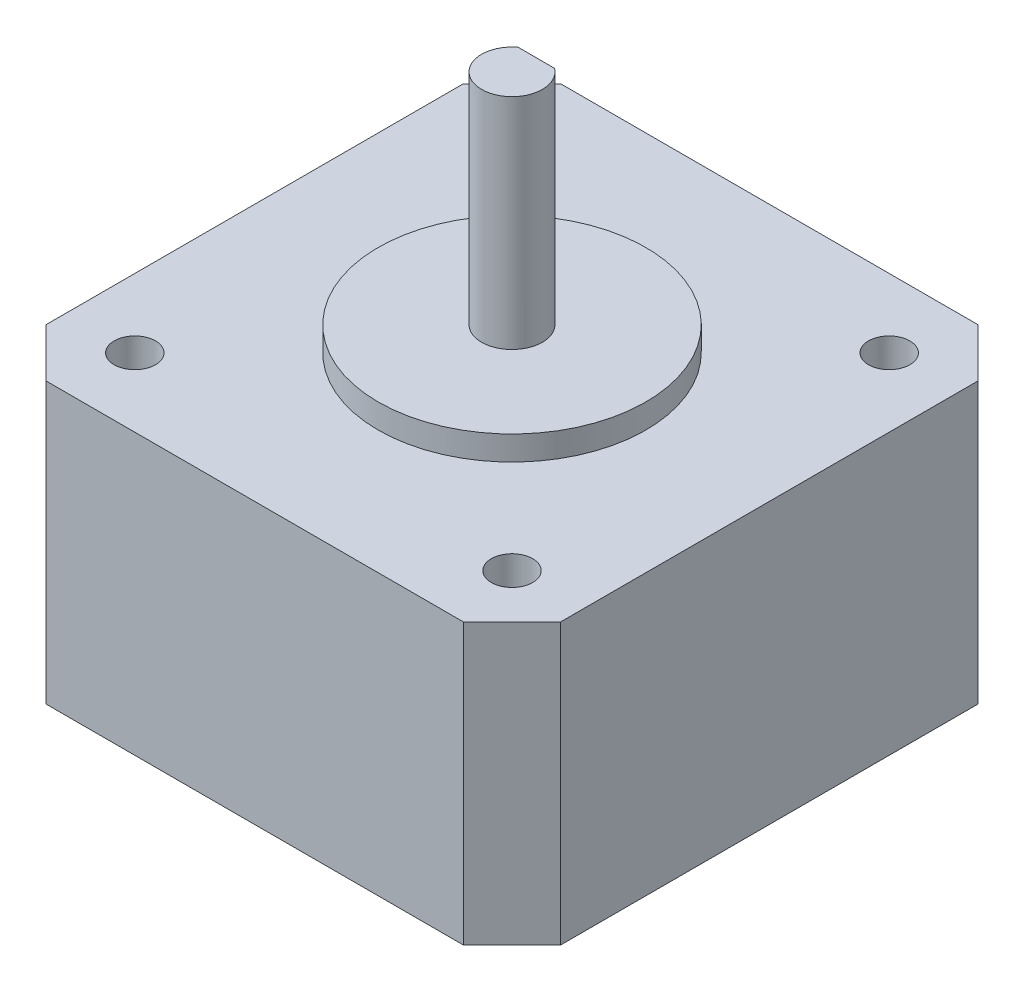
ISO-10303-21;
HEADER;
FILE_DESCRIPTION(('STEP AP214'),'2;1');
FILE_NAME('part.step','',(''),(''),'','','');
FILE_SCHEMA(('AUTOMOTIVE_DESIGN { 1 0 10303 214 1 1 1 1 }'));
ENDSEC;
DATA;
#1=APPLICATION_CONTEXT('core data for automotive mechanical design processes');
#2=APPLICATION_PROTOCOL_DEFINITION('international standard','automotive_design',2000,#1);
#3=PRODUCT_CONTEXT('',#1,'mechanical');
#4=PRODUCT('Part','Part','',(#3));
#5=PRODUCT_RELATED_PRODUCT_CATEGORY('part','',(#4));
#6=PRODUCT_DEFINITION_FORMATION('','',#4);
#7=PRODUCT_DEFINITION_CONTEXT('part definition',#1,'design');
#8=PRODUCT_DEFINITION('design','',#6,#7);
#9=PRODUCT_DEFINITION_SHAPE('','',#8);
#10=(LENGTH_UNIT() NAMED_UNIT(*) SI_UNIT(.MILLI.,.METRE.));
#11=(NAMED_UNIT(*) PLANE_ANGLE_UNIT() SI_UNIT($,.RADIAN.));
#12=(NAMED_UNIT(*) SI_UNIT($,.STERADIAN.) SOLID_ANGLE_UNIT());
#13=UNCERTAINTY_MEASURE_WITH_UNIT(LENGTH_MEASURE(1.E-05),#10,'distance_accuracy_value','');
#14=(GEOMETRIC_REPRESENTATION_CONTEXT(3) GLOBAL_UNCERTAINTY_ASSIGNED_CONTEXT((#13)) GLOBAL_UNIT_ASSIGNED_CONTEXT((#10,
#11,#12)) REPRESENTATION_CONTEXT('',''));
#15=CARTESIAN_POINT('',(0.,0.,0.));
#16=DIRECTION('',(0.,0.,1.));
#17=DIRECTION('',(1.,0.,0.));
#18=AXIS2_PLACEMENT_3D('',#15,#16,#17);
#19=CARTESIAN_POINT('',(17.15,23.,21.15));
#20=DIRECTION('',(-0.707106781186547,0.,-0.707106781186547));
#21=DIRECTION('',(-0.707106781186548,0.,0.707106781186548));
#22=AXIS2_PLACEMENT_3D('',#19,#20,#21);
#23=PLANE('',#22);
#24=DIRECTION('',(0.707106781186548,0.,-0.707106781186548));
#25=VECTOR('',#24,1.);
#26=CARTESIAN_POINT('',(17.15,0.,21.15));
#27=LINE('',#26,#25);
#28=CARTESIAN_POINT('',(17.15,0.,21.15));
#29=VERTEX_POINT('',#28);
#30=CARTESIAN_POINT('',(21.15,0.,17.15));
#31=VERTEX_POINT('',#30);
#32=EDGE_CURVE('E148',#29,#31,#27,.T.);
#33=ORIENTED_EDGE('',*,*,#32,.T.);
#34=DIRECTION('',(0.,-1.,0.));
#35=VECTOR('',#34,1.);
#36=CARTESIAN_POINT('',(21.15,23.,17.15));
#37=LINE('',#36,#35);
#38=CARTESIAN_POINT('',(21.15,23.,17.15));
#39=VERTEX_POINT('',#38);
#40=EDGE_CURVE('E45',#39,#31,#37,.T.);
#41=ORIENTED_EDGE('',*,*,#40,.F.);
#42=DIRECTION('',(0.707106781186548,0.,-0.707106781186548));
#43=VECTOR('',#42,1.);
#44=CARTESIAN_POINT('',(17.15,23.,21.15));
#45=LINE('',#44,#43);
#46=CARTESIAN_POINT('',(17.15,23.,21.15));
#47=VERTEX_POINT('',#46);
#48=EDGE_CURVE('E164',#47,#39,#45,.T.);
#49=ORIENTED_EDGE('',*,*,#48,.F.);
#50=DIRECTION('',(0.,-1.,0.));
#51=VECTOR('',#50,1.);
#52=CARTESIAN_POINT('',(17.15,23.,21.15));
#53=LINE('',#52,#51);
#54=EDGE_CURVE('E144',#47,#29,#53,.T.);
#55=ORIENTED_EDGE('',*,*,#54,.T.);
#56=EDGE_LOOP('',(#33,#41,#49,#55));
#57=FACE_BOUND('',#56,.T.);
#58=ADVANCED_FACE('F37',(#57),#23,.F.);
#59=CARTESIAN_POINT('',(21.15,23.,17.15));
#60=DIRECTION('',(-1.,0.,0.));
#61=DIRECTION('',(0.,0.,1.));
#62=AXIS2_PLACEMENT_3D('',#59,#60,#61);
#63=PLANE('',#62);
#64=DIRECTION('',(0.,0.,-1.));
#65=VECTOR('',#64,1.);
#66=CARTESIAN_POINT('',(21.15,0.,17.15));
#67=LINE('',#66,#65);
#68=CARTESIAN_POINT('',(21.15,0.,-17.15));
#69=VERTEX_POINT('',#68);
#70=EDGE_CURVE('E151',#31,#69,#67,.T.);
#71=ORIENTED_EDGE('',*,*,#70,.T.);
#72=DIRECTION('',(0.,-1.,0.));
#73=VECTOR('',#72,1.);
#74=CARTESIAN_POINT('',(21.15,23.,-17.15));
#75=LINE('',#74,#73);
#76=CARTESIAN_POINT('',(21.15,23.,-17.15));
#77=VERTEX_POINT('',#76);
#78=EDGE_CURVE('E174',#77,#69,#75,.T.);
#79=ORIENTED_EDGE('',*,*,#78,.F.);
#80=DIRECTION('',(0.,0.,-1.));
#81=VECTOR('',#80,1.);
#82=CARTESIAN_POINT('',(21.15,23.,17.15));
#83=LINE('',#82,#81);
#84=EDGE_CURVE('E104',#39,#77,#83,.T.);
#85=ORIENTED_EDGE('',*,*,#84,.F.);
#86=ORIENTED_EDGE('',*,*,#40,.T.);
#87=EDGE_LOOP('',(#71,#79,#85,#86));
#88=FACE_BOUND('',#87,.T.);
#89=ADVANCED_FACE('F230',(#88),#63,.F.);
#90=CARTESIAN_POINT('',(21.15,23.,-17.15));
#91=DIRECTION('',(-0.707106781186547,0.,0.707106781186548));
#92=DIRECTION('',(0.707106781186548,0.,0.707106781186547));
#93=AXIS2_PLACEMENT_3D('',#90,#91,#92);
#94=PLANE('',#93);
#95=DIRECTION('',(-0.707106781186548,0.,-0.707106781186547));
#96=VECTOR('',#95,1.);
#97=CARTESIAN_POINT('',(21.15,0.,-17.15));
#98=LINE('',#97,#96);
#99=CARTESIAN_POINT('',(17.15,0.,-21.15));
#100=VERTEX_POINT('',#99);
#101=EDGE_CURVE('E154',#69,#100,#98,.T.);
#102=ORIENTED_EDGE('',*,*,#101,.T.);
#103=DIRECTION('',(0.,-1.,0.));
#104=VECTOR('',#103,1.);
#105=CARTESIAN_POINT('',(17.15,23.,-21.15));
#106=LINE('',#105,#104);
#107=CARTESIAN_POINT('',(17.15,23.,-21.15));
#108=VERTEX_POINT('',#107);
#109=EDGE_CURVE('E171',#108,#100,#106,.T.);
#110=ORIENTED_EDGE('',*,*,#109,.F.);
#111=DIRECTION('',(-0.707106781186548,0.,-0.707106781186547));
#112=VECTOR('',#111,1.);
#113=CARTESIAN_POINT('',(21.15,23.,-17.15));
#114=LINE('',#113,#112);
#115=EDGE_CURVE('E210',#77,#108,#114,.T.);
#116=ORIENTED_EDGE('',*,*,#115,.F.);
#117=ORIENTED_EDGE('',*,*,#78,.T.);
#118=EDGE_LOOP('',(#102,#110,#116,#117));
#119=FACE_BOUND('',#118,.T.);
#120=ADVANCED_FACE('F233',(#119),#94,.F.);
#121=CARTESIAN_POINT('',(17.15,23.,-21.15));
#122=DIRECTION('',(0.,0.,1.));
#123=DIRECTION('',(1.,0.,0.));
#124=AXIS2_PLACEMENT_3D('',#121,#122,#123);
#125=PLANE('',#124);
#126=DIRECTION('',(-1.,0.,0.));
#127=VECTOR('',#126,1.);
#128=CARTESIAN_POINT('',(17.15,0.,-21.15));
#129=LINE('',#128,#127);
#130=CARTESIAN_POINT('',(-17.15,0.,-21.15));
#131=VERTEX_POINT('',#130);
#132=EDGE_CURVE('E156',#100,#131,#129,.T.);
#133=ORIENTED_EDGE('',*,*,#132,.T.);
#134=DIRECTION('',(0.,-1.,0.));
#135=VECTOR('',#134,1.);
#136=CARTESIAN_POINT('',(-17.15,23.,-21.15));
#137=LINE('',#136,#135);
#138=CARTESIAN_POINT('',(-17.15,23.,-21.15));
#139=VERTEX_POINT('',#138);
#140=EDGE_CURVE('E168',#139,#131,#137,.T.);
#141=ORIENTED_EDGE('',*,*,#140,.F.);
#142=DIRECTION('',(-1.,0.,0.));
#143=VECTOR('',#142,1.);
#144=CARTESIAN_POINT('',(17.15,23.,-21.15));
#145=LINE('',#144,#143);
#146=EDGE_CURVE('E212',#108,#139,#145,.T.);
#147=ORIENTED_EDGE('',*,*,#146,.F.);
#148=ORIENTED_EDGE('',*,*,#109,.T.);
#149=EDGE_LOOP('',(#133,#141,#147,#148));
#150=FACE_BOUND('',#149,.T.);
#151=ADVANCED_FACE('F218',(#150),#125,.F.);
#152=CARTESIAN_POINT('',(-17.15,23.,-21.15));
#153=DIRECTION('',(0.707106781186547,0.,0.707106781186548));
#154=DIRECTION('',(0.707106781186548,0.,-0.707106781186547));
#155=AXIS2_PLACEMENT_3D('',#152,#153,#154);
#156=PLANE('',#155);
#157=DIRECTION('',(-0.707106781186548,0.,0.707106781186547));
#158=VECTOR('',#157,1.);
#159=CARTESIAN_POINT('',(-17.15,0.,-21.15));
#160=LINE('',#159,#158);
#161=CARTESIAN_POINT('',(-21.15,0.,-17.15));
#162=VERTEX_POINT('',#161);
#163=EDGE_CURVE('E158',#131,#162,#160,.T.);
#164=ORIENTED_EDGE('',*,*,#163,.T.);
#165=DIRECTION('',(0.,-1.,0.));
#166=VECTOR('',#165,1.);
#167=CARTESIAN_POINT('',(-21.15,23.,-17.15));
#168=LINE('',#167,#166);
#169=CARTESIAN_POINT('',(-21.15,23.,-17.15));
#170=VERTEX_POINT('',#169);
#171=EDGE_CURVE('E139',#170,#162,#168,.T.);
#172=ORIENTED_EDGE('',*,*,#171,.F.);
#173=DIRECTION('',(-0.707106781186548,0.,0.707106781186547));
#174=VECTOR('',#173,1.);
#175=CARTESIAN_POINT('',(-17.15,23.,-21.15));
#176=LINE('',#175,#174);
#177=EDGE_CURVE('E127',#139,#170,#176,.T.);
#178=ORIENTED_EDGE('',*,*,#177,.F.);
#179=ORIENTED_EDGE('',*,*,#140,.T.);
#180=EDGE_LOOP('',(#164,#172,#178,#179));
#181=FACE_BOUND('',#180,.T.);
#182=ADVANCED_FACE('F222',(#181),#156,.F.);
#183=CARTESIAN_POINT('',(-21.15,23.,-17.15));
#184=DIRECTION('',(1.,0.,0.));
#185=DIRECTION('',(0.,0.,-1.));
#186=AXIS2_PLACEMENT_3D('',#183,#184,#185);
#187=PLANE('',#186);
#188=DIRECTION('',(0.,0.,1.));
#189=VECTOR('',#188,1.);
#190=CARTESIAN_POINT('',(-21.15,0.,-17.15));
#191=LINE('',#190,#189);
#192=CARTESIAN_POINT('',(-21.15,0.,17.15));
#193=VERTEX_POINT('',#192);
#194=EDGE_CURVE('E136',#162,#193,#191,.T.);
#195=ORIENTED_EDGE('',*,*,#194,.T.);
#196=DIRECTION('',(0.,-1.,0.));
#197=VECTOR('',#196,1.);
#198=CARTESIAN_POINT('',(-21.15,23.,17.15));
#199=LINE('',#198,#197);
#200=CARTESIAN_POINT('',(-21.15,23.,17.15));
#201=VERTEX_POINT('',#200);
#202=EDGE_CURVE('E133',#201,#193,#199,.T.);
#203=ORIENTED_EDGE('',*,*,#202,.F.);
#204=DIRECTION('',(0.,0.,1.));
#205=VECTOR('',#204,1.);
#206=CARTESIAN_POINT('',(-21.15,23.,-17.15));
#207=LINE('',#206,#205);
#208=EDGE_CURVE('E120',#170,#201,#207,.T.);
#209=ORIENTED_EDGE('',*,*,#208,.F.);
#210=ORIENTED_EDGE('',*,*,#171,.T.);
#211=EDGE_LOOP('',(#195,#203,#209,#210));
#212=FACE_BOUND('',#211,.T.);
#213=ADVANCED_FACE('F134',(#212),#187,.F.);
#214=CARTESIAN_POINT('',(-21.15,23.,17.15));
#215=DIRECTION('',(0.707106781186548,0.,-0.707106781186547));
#216=DIRECTION('',(-0.707106781186547,0.,-0.707106781186548));
#217=AXIS2_PLACEMENT_3D('',#214,#215,#216);
#218=PLANE('',#217);
#219=DIRECTION('',(0.707106781186547,0.,0.707106781186548));
#220=VECTOR('',#219,1.);
#221=CARTESIAN_POINT('',(-21.15,0.,17.15));
#222=LINE('',#221,#220);
#223=CARTESIAN_POINT('',(-17.15,0.,21.15));
#224=VERTEX_POINT('',#223);
#225=EDGE_CURVE('E161',#193,#224,#222,.T.);
#226=ORIENTED_EDGE('',*,*,#225,.T.);
#227=DIRECTION('',(0.,-1.,0.));
#228=VECTOR('',#227,1.);
#229=CARTESIAN_POINT('',(-17.15,23.,21.15));
#230=LINE('',#229,#228);
#231=CARTESIAN_POINT('',(-17.15,23.,21.15));
#232=VERTEX_POINT('',#231);
#233=EDGE_CURVE('E140',#232,#224,#230,.T.);
#234=ORIENTED_EDGE('',*,*,#233,.F.);
#235=DIRECTION('',(0.707106781186547,0.,0.707106781186548));
#236=VECTOR('',#235,1.);
#237=CARTESIAN_POINT('',(-21.15,23.,17.15));
#238=LINE('',#237,#236);
#239=EDGE_CURVE('E124',#201,#232,#238,.T.);
#240=ORIENTED_EDGE('',*,*,#239,.F.);
#241=ORIENTED_EDGE('',*,*,#202,.T.);
#242=EDGE_LOOP('',(#226,#234,#240,#241));
#243=FACE_BOUND('',#242,.T.);
#244=ADVANCED_FACE('F142',(#243),#218,.F.);
#245=CARTESIAN_POINT('',(-17.15,23.,21.15));
#246=DIRECTION('',(0.,0.,-1.));
#247=DIRECTION('',(-1.,0.,0.));
#248=AXIS2_PLACEMENT_3D('',#245,#246,#247);
#249=PLANE('',#248);
#250=DIRECTION('',(1.,0.,0.));
#251=VECTOR('',#250,1.);
#252=CARTESIAN_POINT('',(-17.15,0.,21.15));
#253=LINE('',#252,#251);
#254=EDGE_CURVE('E95',#224,#29,#253,.T.);
#255=ORIENTED_EDGE('',*,*,#254,.T.);
#256=ORIENTED_EDGE('',*,*,#54,.F.);
#257=DIRECTION('',(1.,0.,0.));
#258=VECTOR('',#257,1.);
#259=CARTESIAN_POINT('',(-17.15,23.,21.15));
#260=LINE('',#259,#258);
#261=EDGE_CURVE('E62',#232,#47,#260,.T.);
#262=ORIENTED_EDGE('',*,*,#261,.F.);
#263=ORIENTED_EDGE('',*,*,#233,.T.);
#264=EDGE_LOOP('',(#255,#256,#262,#263));
#265=FACE_BOUND('',#264,.T.);
#266=ADVANCED_FACE('F226',(#265),#249,.F.);
#267=CARTESIAN_POINT('',(0.,23.,0.));
#268=DIRECTION('',(0.,1.,0.));
#269=DIRECTION('',(0.,0.,1.));
#270=AXIS2_PLACEMENT_3D('',#267,#268,#269);
#271=PLANE('',#270);
#272=CARTESIAN_POINT('',(0.,23.,0.));
#273=DIRECTION('',(0.,1.,0.));
#274=DIRECTION('',(0.,0.,1.));
#275=AXIS2_PLACEMENT_3D('',#272,#273,#274);
#276=CIRCLE('',#275,11.);
#277=CARTESIAN_POINT('',(0.,23.,11.));
#278=VERTEX_POINT('',#277);
#279=EDGE_CURVE('E521',#278,#278,#276,.T.);
#280=ORIENTED_EDGE('',*,*,#279,.F.);
#281=EDGE_LOOP('',(#280));
#282=FACE_BOUND('',#281,.T.);
#283=CARTESIAN_POINT('',(15.5,23.,-15.5));
#284=DIRECTION('',(0.,1.,0.));
#285=DIRECTION('',(0.,0.,1.));
#286=AXIS2_PLACEMENT_3D('',#283,#284,#285);
#287=CIRCLE('',#286,1.7);
#288=CARTESIAN_POINT('',(15.5,23.,-13.8));
#289=VERTEX_POINT('',#288);
#290=EDGE_CURVE('E40',#289,#289,#287,.T.);
#291=ORIENTED_EDGE('',*,*,#290,.F.);
#292=EDGE_LOOP('',(#291));
#293=FACE_BOUND('',#292,.T.);
#294=CARTESIAN_POINT('',(-15.5,23.,-15.5));
#295=DIRECTION('',(0.,1.,0.));
#296=DIRECTION('',(0.,0.,1.));
#297=AXIS2_PLACEMENT_3D('',#294,#295,#296);
#298=CIRCLE('',#297,1.7);
#299=CARTESIAN_POINT('',(-15.5,23.,-13.8));
#300=VERTEX_POINT('',#299);
#301=EDGE_CURVE('E185',#300,#300,#298,.T.);
#302=ORIENTED_EDGE('',*,*,#301,.F.);
#303=EDGE_LOOP('',(#302));
#304=FACE_BOUND('',#303,.T.);
#305=CARTESIAN_POINT('',(-15.5,23.,15.5));
#306=DIRECTION('',(0.,1.,0.));
#307=DIRECTION('',(0.,0.,1.));
#308=AXIS2_PLACEMENT_3D('',#305,#306,#307);
#309=CIRCLE('',#308,1.7);
#310=CARTESIAN_POINT('',(-15.5,23.,17.2));
#311=VERTEX_POINT('',#310);
#312=EDGE_CURVE('E181',#311,#311,#309,.T.);
#313=ORIENTED_EDGE('',*,*,#312,.F.);
#314=EDGE_LOOP('',(#313));
#315=FACE_BOUND('',#314,.T.);
#316=CARTESIAN_POINT('',(15.5,23.,15.5));
#317=DIRECTION('',(0.,1.,0.));
#318=DIRECTION('',(0.,0.,1.));
#319=AXIS2_PLACEMENT_3D('',#316,#317,#318);
#320=CIRCLE('',#319,1.7);
#321=CARTESIAN_POINT('',(15.5,23.,17.2));
#322=VERTEX_POINT('',#321);
#323=EDGE_CURVE('E152',#322,#322,#320,.T.);
#324=ORIENTED_EDGE('',*,*,#323,.F.);
#325=EDGE_LOOP('',(#324));
#326=FACE_BOUND('',#325,.T.);
#327=ORIENTED_EDGE('',*,*,#48,.T.);
#328=ORIENTED_EDGE('',*,*,#84,.T.);
#329=ORIENTED_EDGE('',*,*,#115,.T.);
#330=ORIENTED_EDGE('',*,*,#146,.T.);
#331=ORIENTED_EDGE('',*,*,#177,.T.);
#332=ORIENTED_EDGE('',*,*,#208,.T.);
#333=ORIENTED_EDGE('',*,*,#239,.T.);
#334=ORIENTED_EDGE('',*,*,#261,.T.);
#335=EDGE_LOOP('',(#327,#328,#329,#330,#331,#332,#333,#334));
#336=FACE_BOUND('',#335,.T.);
#337=ADVANCED_FACE('F122',(#282,#293,#304,#315,#326,#336),#271,.T.);
#338=CARTESIAN_POINT('',(0.,0.,0.));
#339=DIRECTION('',(0.,1.,0.));
#340=DIRECTION('',(0.,0.,1.));
#341=AXIS2_PLACEMENT_3D('',#338,#339,#340);
#342=PLANE('',#341);
#343=CARTESIAN_POINT('',(15.5,0.,-15.5));
#344=DIRECTION('',(0.,-1.,0.));
#345=DIRECTION('',(0.,0.,-1.));
#346=AXIS2_PLACEMENT_3D('',#343,#344,#345);
#347=CIRCLE('',#346,1.725);
#348=CARTESIAN_POINT('',(15.5,0.,-17.225));
#349=VERTEX_POINT('',#348);
#350=EDGE_CURVE('E526',#349,#349,#347,.T.);
#351=ORIENTED_EDGE('',*,*,#350,.F.);
#352=EDGE_LOOP('',(#351));
#353=FACE_BOUND('',#352,.T.);
#354=CARTESIAN_POINT('',(-15.5,0.,-15.5));
#355=DIRECTION('',(0.,-1.,0.));
#356=DIRECTION('',(0.,0.,-1.));
#357=AXIS2_PLACEMENT_3D('',#354,#355,#356);
#358=CIRCLE('',#357,1.725);
#359=CARTESIAN_POINT('',(-15.5,0.,-17.225));
#360=VERTEX_POINT('',#359);
#361=EDGE_CURVE('E194',#360,#360,#358,.T.);
#362=ORIENTED_EDGE('',*,*,#361,.F.);
#363=EDGE_LOOP('',(#362));
#364=FACE_BOUND('',#363,.T.);
#365=CARTESIAN_POINT('',(-15.5,0.,15.5));
#366=DIRECTION('',(0.,-1.,0.));
#367=DIRECTION('',(0.,0.,-1.));
#368=AXIS2_PLACEMENT_3D('',#365,#366,#367);
#369=CIRCLE('',#368,1.725);
#370=CARTESIAN_POINT('',(-15.5,0.,13.775));
#371=VERTEX_POINT('',#370);
#372=EDGE_CURVE('E187',#371,#371,#369,.T.);
#373=ORIENTED_EDGE('',*,*,#372,.F.);
#374=EDGE_LOOP('',(#373));
#375=FACE_BOUND('',#374,.T.);
#376=CARTESIAN_POINT('',(15.5,0.,15.5));
#377=DIRECTION('',(0.,-1.,0.));
#378=DIRECTION('',(0.,0.,-1.));
#379=AXIS2_PLACEMENT_3D('',#376,#377,#378);
#380=CIRCLE('',#379,1.725);
#381=CARTESIAN_POINT('',(15.5,0.,13.775));
#382=VERTEX_POINT('',#381);
#383=EDGE_CURVE('E183',#382,#382,#380,.T.);
#384=ORIENTED_EDGE('',*,*,#383,.F.);
#385=EDGE_LOOP('',(#384));
#386=FACE_BOUND('',#385,.T.);
#387=ORIENTED_EDGE('',*,*,#32,.F.);
#388=ORIENTED_EDGE('',*,*,#254,.F.);
#389=ORIENTED_EDGE('',*,*,#225,.F.);
#390=ORIENTED_EDGE('',*,*,#194,.F.);
#391=ORIENTED_EDGE('',*,*,#163,.F.);
#392=ORIENTED_EDGE('',*,*,#132,.F.);
#393=ORIENTED_EDGE('',*,*,#101,.F.);
#394=ORIENTED_EDGE('',*,*,#70,.F.);
#395=EDGE_LOOP('',(#387,#388,#389,#390,#391,#392,#393,#394));
#396=FACE_BOUND('',#395,.T.);
#397=ADVANCED_FACE('F225',(#353,#364,#375,#386,#396),#342,.F.);
#398=CARTESIAN_POINT('',(15.5,0.,15.5));
#399=DIRECTION('',(0.,-1.,0.));
#400=DIRECTION('',(0.,0.,-1.));
#401=AXIS2_PLACEMENT_3D('',#398,#399,#400);
#402=CYLINDRICAL_SURFACE('',#401,1.7);
#403=ORIENTED_EDGE('',*,*,#323,.T.);
#404=EDGE_LOOP('',(#403));
#405=FACE_BOUND('',#404,.T.);
#406=CARTESIAN_POINT('',(15.5,0.0250000000000007,15.5));
#407=DIRECTION('',(0.,-1.,0.));
#408=DIRECTION('',(0.,0.,-1.));
#409=AXIS2_PLACEMENT_3D('',#406,#407,#408);
#410=CIRCLE('',#409,1.7);
#411=CARTESIAN_POINT('',(15.5,0.0250000000000007,13.8));
#412=VERTEX_POINT('',#411);
#413=EDGE_CURVE('E180',#412,#412,#410,.T.);
#414=ORIENTED_EDGE('',*,*,#413,.T.);
#415=EDGE_LOOP('',(#414));
#416=FACE_BOUND('',#415,.T.);
#417=ADVANCED_FACE('F308',(#405,#416),#402,.F.);
#418=CARTESIAN_POINT('',(15.5,0.,15.5));
#419=DIRECTION('',(0.,-1.,0.));
#420=DIRECTION('',(0.,0.,-1.));
#421=AXIS2_PLACEMENT_3D('',#418,#419,#420);
#422=CONICAL_SURFACE('',#421,1.725,0.785398163397431);
#423=ORIENTED_EDGE('',*,*,#413,.F.);
#424=EDGE_LOOP('',(#423));
#425=FACE_BOUND('',#424,.T.);
#426=ORIENTED_EDGE('',*,*,#383,.T.);
#427=EDGE_LOOP('',(#426));
#428=FACE_BOUND('',#427,.T.);
#429=ADVANCED_FACE('F319',(#425,#428),#422,.F.);
#430=CARTESIAN_POINT('',(-15.5,0.,15.5));
#431=DIRECTION('',(0.,-1.,0.));
#432=DIRECTION('',(0.,0.,-1.));
#433=AXIS2_PLACEMENT_3D('',#430,#431,#432);
#434=CYLINDRICAL_SURFACE('',#433,1.7);
#435=ORIENTED_EDGE('',*,*,#312,.T.);
#436=EDGE_LOOP('',(#435));
#437=FACE_BOUND('',#436,.T.);
#438=CARTESIAN_POINT('',(-15.5,0.0250000000000007,15.5));
#439=DIRECTION('',(0.,-1.,0.));
#440=DIRECTION('',(0.,0.,-1.));
#441=AXIS2_PLACEMENT_3D('',#438,#439,#440);
#442=CIRCLE('',#441,1.7);
#443=CARTESIAN_POINT('',(-15.5,0.0250000000000007,13.8));
#444=VERTEX_POINT('',#443);
#445=EDGE_CURVE('E184',#444,#444,#442,.T.);
#446=ORIENTED_EDGE('',*,*,#445,.T.);
#447=EDGE_LOOP('',(#446));
#448=FACE_BOUND('',#447,.T.);
#449=ADVANCED_FACE('F330',(#437,#448),#434,.F.);
#450=CARTESIAN_POINT('',(-15.5,0.,15.5));
#451=DIRECTION('',(0.,-1.,0.));
#452=DIRECTION('',(0.,0.,-1.));
#453=AXIS2_PLACEMENT_3D('',#450,#451,#452);
#454=CONICAL_SURFACE('',#453,1.725,0.785398163397431);
#455=ORIENTED_EDGE('',*,*,#445,.F.);
#456=EDGE_LOOP('',(#455));
#457=FACE_BOUND('',#456,.T.);
#458=ORIENTED_EDGE('',*,*,#372,.T.);
#459=EDGE_LOOP('',(#458));
#460=FACE_BOUND('',#459,.T.);
#461=ADVANCED_FACE('F341',(#457,#460),#454,.F.);
#462=CARTESIAN_POINT('',(-15.5,0.,-15.5));
#463=DIRECTION('',(0.,-1.,0.));
#464=DIRECTION('',(0.,0.,-1.));
#465=AXIS2_PLACEMENT_3D('',#462,#463,#464);
#466=CYLINDRICAL_SURFACE('',#465,1.7);
#467=ORIENTED_EDGE('',*,*,#301,.T.);
#468=EDGE_LOOP('',(#467));
#469=FACE_BOUND('',#468,.T.);
#470=CARTESIAN_POINT('',(-15.5,0.0250000000000007,-15.5));
#471=DIRECTION('',(0.,-1.,0.));
#472=DIRECTION('',(0.,0.,-1.));
#473=AXIS2_PLACEMENT_3D('',#470,#471,#472);
#474=CIRCLE('',#473,1.7);
#475=CARTESIAN_POINT('',(-15.5,0.0250000000000007,-17.2));
#476=VERTEX_POINT('',#475);
#477=EDGE_CURVE('E188',#476,#476,#474,.T.);
#478=ORIENTED_EDGE('',*,*,#477,.T.);
#479=EDGE_LOOP('',(#478));
#480=FACE_BOUND('',#479,.T.);
#481=ADVANCED_FACE('F352',(#469,#480),#466,.F.);
#482=CARTESIAN_POINT('',(-15.5,0.,-15.5));
#483=DIRECTION('',(0.,-1.,0.));
#484=DIRECTION('',(0.,0.,-1.));
#485=AXIS2_PLACEMENT_3D('',#482,#483,#484);
#486=CONICAL_SURFACE('',#485,1.725,0.785398163397431);
#487=ORIENTED_EDGE('',*,*,#477,.F.);
#488=EDGE_LOOP('',(#487));
#489=FACE_BOUND('',#488,.T.);
#490=ORIENTED_EDGE('',*,*,#361,.T.);
#491=EDGE_LOOP('',(#490));
#492=FACE_BOUND('',#491,.T.);
#493=ADVANCED_FACE('F363',(#489,#492),#486,.F.);
#494=CARTESIAN_POINT('',(15.5,0.,-15.5));
#495=DIRECTION('',(0.,-1.,0.));
#496=DIRECTION('',(0.,0.,-1.));
#497=AXIS2_PLACEMENT_3D('',#494,#495,#496);
#498=CYLINDRICAL_SURFACE('',#497,1.7);
#499=ORIENTED_EDGE('',*,*,#290,.T.);
#500=EDGE_LOOP('',(#499));
#501=FACE_BOUND('',#500,.T.);
#502=CARTESIAN_POINT('',(15.5,0.0250000000000007,-15.5));
#503=DIRECTION('',(0.,-1.,0.));
#504=DIRECTION('',(0.,0.,-1.));
#505=AXIS2_PLACEMENT_3D('',#502,#503,#504);
#506=CIRCLE('',#505,1.7);
#507=CARTESIAN_POINT('',(15.5,0.0250000000000007,-17.2));
#508=VERTEX_POINT('',#507);
#509=EDGE_CURVE('E530',#508,#508,#506,.T.);
#510=ORIENTED_EDGE('',*,*,#509,.T.);
#511=EDGE_LOOP('',(#510));
#512=FACE_BOUND('',#511,.T.);
#513=ADVANCED_FACE('F373',(#501,#512),#498,.F.);
#514=CARTESIAN_POINT('',(15.5,0.,-15.5));
#515=DIRECTION('',(0.,-1.,0.));
#516=DIRECTION('',(0.,0.,-1.));
#517=AXIS2_PLACEMENT_3D('',#514,#515,#516);
#518=CONICAL_SURFACE('',#517,1.725,0.785398163397431);
#519=ORIENTED_EDGE('',*,*,#509,.F.);
#520=EDGE_LOOP('',(#519));
#521=FACE_BOUND('',#520,.T.);
#522=ORIENTED_EDGE('',*,*,#350,.T.);
#523=EDGE_LOOP('',(#522));
#524=FACE_BOUND('',#523,.T.);
#525=ADVANCED_FACE('F384',(#521,#524),#518,.F.);
#526=CARTESIAN_POINT('',(0.,25.,0.));
#527=DIRECTION('',(0.,-1.,0.));
#528=DIRECTION('',(0.,0.,-1.));
#529=AXIS2_PLACEMENT_3D('',#526,#527,#528);
#530=CYLINDRICAL_SURFACE('',#529,11.);
#531=CARTESIAN_POINT('',(0.,25.,0.));
#532=DIRECTION('',(0.,1.,0.));
#533=DIRECTION('',(0.,0.,1.));
#534=AXIS2_PLACEMENT_3D('',#531,#532,#533);
#535=CIRCLE('',#534,11.);
#536=CARTESIAN_POINT('',(0.,25.,11.));
#537=VERTEX_POINT('',#536);
#538=EDGE_CURVE('E523',#537,#537,#535,.T.);
#539=ORIENTED_EDGE('',*,*,#538,.F.);
#540=EDGE_LOOP('',(#539));
#541=FACE_BOUND('',#540,.T.);
#542=ORIENTED_EDGE('',*,*,#279,.T.);
#543=EDGE_LOOP('',(#542));
#544=FACE_BOUND('',#543,.T.);
#545=ADVANCED_FACE('F395',(#541,#544),#530,.T.);
#546=CARTESIAN_POINT('',(0.,25.,0.));
#547=DIRECTION('',(0.,1.,0.));
#548=DIRECTION('',(0.,0.,1.));
#549=AXIS2_PLACEMENT_3D('',#546,#547,#548);
#550=PLANE('',#549);
#551=CARTESIAN_POINT('',(0.,25.,0.));
#552=DIRECTION('',(0.,1.,0.));
#553=DIRECTION('',(0.,0.,1.));
#554=AXIS2_PLACEMENT_3D('',#551,#552,#553);
#555=CIRCLE('',#554,2.5);
#556=CARTESIAN_POINT('',(0.,25.,2.5));
#557=VERTEX_POINT('',#556);
#558=EDGE_CURVE('E11',#557,#557,#555,.T.);
#559=ORIENTED_EDGE('',*,*,#558,.F.);
#560=EDGE_LOOP('',(#559));
#561=FACE_BOUND('',#560,.T.);
#562=ORIENTED_EDGE('',*,*,#538,.T.);
#563=EDGE_LOOP('',(#562));
#564=FACE_BOUND('',#563,.T.);
#565=ADVANCED_FACE('F414',(#561,#564),#550,.T.);
#566=CARTESIAN_POINT('',(0.,43.,0.));
#567=DIRECTION('',(0.,-1.,0.));
#568=DIRECTION('',(0.,0.,-1.));
#569=AXIS2_PLACEMENT_3D('',#566,#567,#568);
#570=CYLINDRICAL_SURFACE('',#569,2.5);
#571=CARTESIAN_POINT('',(0.,43.,0.));
#572=DIRECTION('',(0.,1.,0.));
#573=DIRECTION('',(0.,0.,1.));
#574=AXIS2_PLACEMENT_3D('',#571,#572,#573);
#575=CIRCLE('',#574,2.5);
#576=CARTESIAN_POINT('',(-1.5,43.,-2.));
#577=VERTEX_POINT('',#576);
#578=CARTESIAN_POINT('',(1.5,43.,-2.));
#579=VERTEX_POINT('',#578);
#580=EDGE_CURVE('E516',#577,#579,#575,.T.);
#581=ORIENTED_EDGE('',*,*,#580,.F.);
#582=DIRECTION('',(0.,1.,0.));
#583=VECTOR('',#582,1.);
#584=CARTESIAN_POINT('',(-1.5,26.,-2.));
#585=LINE('',#584,#583);
#586=CARTESIAN_POINT('',(-1.5,26.,-2.));
#587=VERTEX_POINT('',#586);
#588=EDGE_CURVE('E53',#587,#577,#585,.T.);
#589=ORIENTED_EDGE('',*,*,#588,.F.);
#590=CARTESIAN_POINT('',(0.,26.,0.));
#591=DIRECTION('',(0.,1.,0.));
#592=DIRECTION('',(0.,0.,1.));
#593=AXIS2_PLACEMENT_3D('',#590,#591,#592);
#594=CIRCLE('',#593,2.5);
#595=CARTESIAN_POINT('',(1.5,26.,-2.));
#596=VERTEX_POINT('',#595);
#597=EDGE_CURVE('E504',#596,#587,#594,.T.);
#598=ORIENTED_EDGE('',*,*,#597,.F.);
#599=DIRECTION('',(0.,1.,0.));
#600=VECTOR('',#599,1.);
#601=CARTESIAN_POINT('',(1.5,26.,-2.));
#602=LINE('',#601,#600);
#603=EDGE_CURVE('E511',#596,#579,#602,.T.);
#604=ORIENTED_EDGE('',*,*,#603,.T.);
#605=EDGE_LOOP('',(#581,#589,#598,#604));
#606=FACE_BOUND('',#605,.T.);
#607=ORIENTED_EDGE('',*,*,#558,.T.);
#608=EDGE_LOOP('',(#607));
#609=FACE_BOUND('',#608,.T.);
#610=ADVANCED_FACE('F425',(#606,#609),#570,.T.);
#611=CARTESIAN_POINT('',(0.,43.,0.));
#612=DIRECTION('',(0.,1.,0.));
#613=DIRECTION('',(0.,0.,1.));
#614=AXIS2_PLACEMENT_3D('',#611,#612,#613);
#615=PLANE('',#614);
#616=DIRECTION('',(1.,0.,0.));
#617=VECTOR('',#616,1.);
#618=CARTESIAN_POINT('',(-1.5,43.,-2.));
#619=LINE('',#618,#617);
#620=EDGE_CURVE('E508',#577,#579,#619,.T.);
#621=ORIENTED_EDGE('',*,*,#620,.F.);
#622=ORIENTED_EDGE('',*,*,#580,.T.);
#623=EDGE_LOOP('',(#621,#622));
#624=FACE_BOUND('',#623,.T.);
#625=ADVANCED_FACE('F436',(#624),#615,.T.);
#626=CARTESIAN_POINT('',(-1.5,26.,-2.));
#627=DIRECTION('',(0.,0.,1.));
#628=DIRECTION('',(1.,0.,0.));
#629=AXIS2_PLACEMENT_3D('',#626,#627,#628);
#630=PLANE('',#629);
#631=ORIENTED_EDGE('',*,*,#620,.T.);
#632=ORIENTED_EDGE('',*,*,#603,.F.);
#633=DIRECTION('',(1.,0.,0.));
#634=VECTOR('',#633,1.);
#635=CARTESIAN_POINT('',(-1.5,26.,-2.));
#636=LINE('',#635,#634);
#637=EDGE_CURVE('E505',#587,#596,#636,.T.);
#638=ORIENTED_EDGE('',*,*,#637,.F.);
#639=ORIENTED_EDGE('',*,*,#588,.T.);
#640=EDGE_LOOP('',(#631,#632,#638,#639));
#641=FACE_BOUND('',#640,.T.);
#642=ADVANCED_FACE('F447',(#641),#630,.F.);
#643=CARTESIAN_POINT('',(0.,26.,0.));
#644=DIRECTION('',(0.,1.,0.));
#645=DIRECTION('',(0.,0.,1.));
#646=AXIS2_PLACEMENT_3D('',#643,#644,#645);
#647=PLANE('',#646);
#648=ORIENTED_EDGE('',*,*,#597,.T.);
#649=ORIENTED_EDGE('',*,*,#637,.T.);
#650=EDGE_LOOP('',(#648,#649));
#651=FACE_BOUND('',#650,.T.);
#652=ADVANCED_FACE('F458',(#651),#647,.T.);
#653=CLOSED_SHELL('',(#58,#89,#120,#151,#182,#213,#244,#266,#337,#397,#417,#429,#449,#461,#481,
#493,#513,#525,#545,#565,#610,#625,#642,#652));
#654=MANIFOLD_SOLID_BREP('B2',#653);
#655=ADVANCED_BREP_SHAPE_REPRESENTATION('',(#18,#654),#14);
#656=SHAPE_DEFINITION_REPRESENTATION(#9,#655);
ENDSEC;
END-ISO-10303-21;
